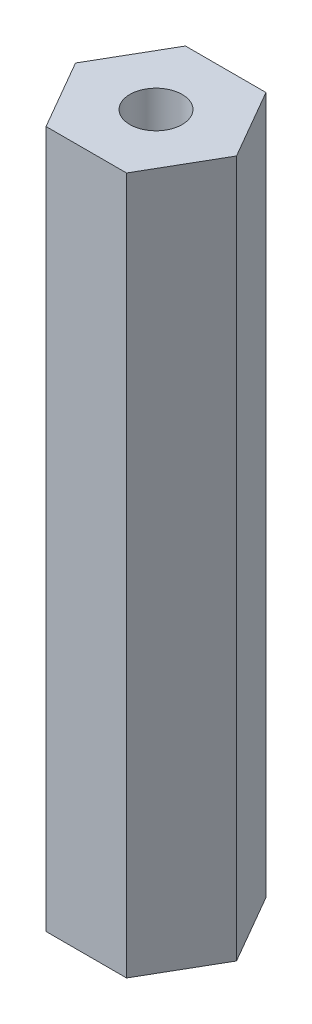
ISO-10303-21;
HEADER;
FILE_DESCRIPTION(('STEP AP214'),'2;1');
FILE_NAME('part.step','',(''),(''),'','','');
FILE_SCHEMA(('AUTOMOTIVE_DESIGN { 1 0 10303 214 1 1 1 1 }'));
ENDSEC;
DATA;
#1=APPLICATION_CONTEXT('core data for automotive mechanical design processes');
#2=APPLICATION_PROTOCOL_DEFINITION('international standard','automotive_design',2000,#1);
#3=PRODUCT_CONTEXT('',#1,'mechanical');
#4=PRODUCT('Part','Part','',(#3));
#5=PRODUCT_RELATED_PRODUCT_CATEGORY('part','',(#4));
#6=PRODUCT_DEFINITION_FORMATION('','',#4);
#7=PRODUCT_DEFINITION_CONTEXT('part definition',#1,'design');
#8=PRODUCT_DEFINITION('design','',#6,#7);
#9=PRODUCT_DEFINITION_SHAPE('','',#8);
#10=(LENGTH_UNIT() NAMED_UNIT(*) SI_UNIT(.MILLI.,.METRE.));
#11=(NAMED_UNIT(*) PLANE_ANGLE_UNIT() SI_UNIT($,.RADIAN.));
#12=(NAMED_UNIT(*) SI_UNIT($,.STERADIAN.) SOLID_ANGLE_UNIT());
#13=UNCERTAINTY_MEASURE_WITH_UNIT(LENGTH_MEASURE(1.E-05),#10,'distance_accuracy_value','');
#14=(GEOMETRIC_REPRESENTATION_CONTEXT(3) GLOBAL_UNCERTAINTY_ASSIGNED_CONTEXT((#13)) GLOBAL_UNIT_ASSIGNED_CONTEXT((#10,
#11,#12)) REPRESENTATION_CONTEXT('',''));
#15=CARTESIAN_POINT('',(0.,0.,0.));
#16=DIRECTION('',(0.,0.,1.));
#17=DIRECTION('',(1.,0.,0.));
#18=AXIS2_PLACEMENT_3D('',#15,#16,#17);
#19=CARTESIAN_POINT('',(3.46410161513775,60.,6.));
#20=DIRECTION('',(-0.866025403784439,0.,-0.5));
#21=DIRECTION('',(-0.5,0.,0.866025403784439));
#22=AXIS2_PLACEMENT_3D('',#19,#20,#21);
#23=PLANE('',#22);
#24=DIRECTION('',(0.5,0.,-0.866025403784439));
#25=VECTOR('',#24,1.);
#26=CARTESIAN_POINT('',(3.46410161513775,0.,6.));
#27=LINE('',#26,#25);
#28=CARTESIAN_POINT('',(3.46410161513775,0.,6.));
#29=VERTEX_POINT('',#28);
#30=CARTESIAN_POINT('',(6.92820323027551,0.,0.));
#31=VERTEX_POINT('',#30);
#32=EDGE_CURVE('E121',#29,#31,#27,.T.);
#33=ORIENTED_EDGE('',*,*,#32,.T.);
#34=DIRECTION('',(0.,-1.,0.));
#35=VECTOR('',#34,1.);
#36=CARTESIAN_POINT('',(6.92820323027551,60.,0.));
#37=LINE('',#36,#35);
#38=CARTESIAN_POINT('',(6.92820323027551,60.,0.));
#39=VERTEX_POINT('',#38);
#40=EDGE_CURVE('E11',#39,#31,#37,.T.);
#41=ORIENTED_EDGE('',*,*,#40,.F.);
#42=DIRECTION('',(0.5,0.,-0.866025403784439));
#43=VECTOR('',#42,1.);
#44=CARTESIAN_POINT('',(3.46410161513775,60.,6.));
#45=LINE('',#44,#43);
#46=CARTESIAN_POINT('',(3.46410161513775,60.,6.));
#47=VERTEX_POINT('',#46);
#48=EDGE_CURVE('E132',#47,#39,#45,.T.);
#49=ORIENTED_EDGE('',*,*,#48,.F.);
#50=DIRECTION('',(0.,-1.,0.));
#51=VECTOR('',#50,1.);
#52=CARTESIAN_POINT('',(3.46410161513775,60.,6.));
#53=LINE('',#52,#51);
#54=EDGE_CURVE('E117',#47,#29,#53,.T.);
#55=ORIENTED_EDGE('',*,*,#54,.T.);
#56=EDGE_LOOP('',(#33,#41,#49,#55));
#57=FACE_BOUND('',#56,.T.);
#58=ADVANCED_FACE('F37',(#57),#23,.F.);
#59=CARTESIAN_POINT('',(6.92820323027551,60.,0.));
#60=DIRECTION('',(-0.866025403784438,0.,0.5));
#61=DIRECTION('',(0.5,0.,0.866025403784439));
#62=AXIS2_PLACEMENT_3D('',#59,#60,#61);
#63=PLANE('',#62);
#64=DIRECTION('',(-0.5,0.,-0.866025403784438));
#65=VECTOR('',#64,1.);
#66=CARTESIAN_POINT('',(6.92820323027551,0.,0.));
#67=LINE('',#66,#65);
#68=CARTESIAN_POINT('',(3.46410161513775,0.,-6.));
#69=VERTEX_POINT('',#68);
#70=EDGE_CURVE('E124',#31,#69,#67,.T.);
#71=ORIENTED_EDGE('',*,*,#70,.T.);
#72=DIRECTION('',(0.,-1.,0.));
#73=VECTOR('',#72,1.);
#74=CARTESIAN_POINT('',(3.46410161513775,60.,-6.));
#75=LINE('',#74,#73);
#76=CARTESIAN_POINT('',(3.46410161513775,60.,-6.));
#77=VERTEX_POINT('',#76);
#78=EDGE_CURVE('E45',#77,#69,#75,.T.);
#79=ORIENTED_EDGE('',*,*,#78,.F.);
#80=DIRECTION('',(-0.5,0.,-0.866025403784438));
#81=VECTOR('',#80,1.);
#82=CARTESIAN_POINT('',(6.92820323027551,60.,0.));
#83=LINE('',#82,#81);
#84=EDGE_CURVE('E90',#39,#77,#83,.T.);
#85=ORIENTED_EDGE('',*,*,#84,.F.);
#86=ORIENTED_EDGE('',*,*,#40,.T.);
#87=EDGE_LOOP('',(#71,#79,#85,#86));
#88=FACE_BOUND('',#87,.T.);
#89=ADVANCED_FACE('F157',(#88),#63,.F.);
#90=CARTESIAN_POINT('',(3.46410161513775,60.,-6.));
#91=DIRECTION('',(0.,0.,1.));
#92=DIRECTION('',(1.,0.,0.));
#93=AXIS2_PLACEMENT_3D('',#90,#91,#92);
#94=PLANE('',#93);
#95=DIRECTION('',(-1.,0.,0.));
#96=VECTOR('',#95,1.);
#97=CARTESIAN_POINT('',(3.46410161513775,0.,-6.));
#98=LINE('',#97,#96);
#99=CARTESIAN_POINT('',(-3.46410161513776,0.,-6.));
#100=VERTEX_POINT('',#99);
#101=EDGE_CURVE('E127',#69,#100,#98,.T.);
#102=ORIENTED_EDGE('',*,*,#101,.T.);
#103=DIRECTION('',(0.,-1.,0.));
#104=VECTOR('',#103,1.);
#105=CARTESIAN_POINT('',(-3.46410161513776,60.,-6.));
#106=LINE('',#105,#104);
#107=CARTESIAN_POINT('',(-3.46410161513776,60.,-6.));
#108=VERTEX_POINT('',#107);
#109=EDGE_CURVE('E112',#108,#100,#106,.T.);
#110=ORIENTED_EDGE('',*,*,#109,.F.);
#111=DIRECTION('',(-1.,0.,0.));
#112=VECTOR('',#111,1.);
#113=CARTESIAN_POINT('',(3.46410161513775,60.,-6.));
#114=LINE('',#113,#112);
#115=EDGE_CURVE('E103',#77,#108,#114,.T.);
#116=ORIENTED_EDGE('',*,*,#115,.F.);
#117=ORIENTED_EDGE('',*,*,#78,.T.);
#118=EDGE_LOOP('',(#102,#110,#116,#117));
#119=FACE_BOUND('',#118,.T.);
#120=ADVANCED_FACE('F138',(#119),#94,.F.);
#121=CARTESIAN_POINT('',(-3.46410161513776,60.,-6.));
#122=DIRECTION('',(0.866025403784439,0.,0.5));
#123=DIRECTION('',(0.5,0.,-0.866025403784439));
#124=AXIS2_PLACEMENT_3D('',#121,#122,#123);
#125=PLANE('',#124);
#126=DIRECTION('',(-0.5,0.,0.866025403784439));
#127=VECTOR('',#126,1.);
#128=CARTESIAN_POINT('',(-3.46410161513776,0.,-6.));
#129=LINE('',#128,#127);
#130=CARTESIAN_POINT('',(-6.92820323027551,0.,0.));
#131=VERTEX_POINT('',#130);
#132=EDGE_CURVE('E111',#100,#131,#129,.T.);
#133=ORIENTED_EDGE('',*,*,#132,.T.);
#134=DIRECTION('',(0.,-1.,0.));
#135=VECTOR('',#134,1.);
#136=CARTESIAN_POINT('',(-6.92820323027551,60.,0.));
#137=LINE('',#136,#135);
#138=CARTESIAN_POINT('',(-6.92820323027551,60.,0.));
#139=VERTEX_POINT('',#138);
#140=EDGE_CURVE('E108',#139,#131,#137,.T.);
#141=ORIENTED_EDGE('',*,*,#140,.F.);
#142=DIRECTION('',(-0.5,0.,0.866025403784439));
#143=VECTOR('',#142,1.);
#144=CARTESIAN_POINT('',(-3.46410161513776,60.,-6.));
#145=LINE('',#144,#143);
#146=EDGE_CURVE('E97',#108,#139,#145,.T.);
#147=ORIENTED_EDGE('',*,*,#146,.F.);
#148=ORIENTED_EDGE('',*,*,#109,.T.);
#149=EDGE_LOOP('',(#133,#141,#147,#148));
#150=FACE_BOUND('',#149,.T.);
#151=ADVANCED_FACE('F109',(#150),#125,.F.);
#152=CARTESIAN_POINT('',(-6.92820323027551,60.,0.));
#153=DIRECTION('',(0.866025403784438,0.,-0.5));
#154=DIRECTION('',(-0.5,0.,-0.866025403784439));
#155=AXIS2_PLACEMENT_3D('',#152,#153,#154);
#156=PLANE('',#155);
#157=DIRECTION('',(0.5,0.,0.866025403784438));
#158=VECTOR('',#157,1.);
#159=CARTESIAN_POINT('',(-6.92820323027551,0.,0.));
#160=LINE('',#159,#158);
#161=CARTESIAN_POINT('',(-3.46410161513775,0.,6.));
#162=VERTEX_POINT('',#161);
#163=EDGE_CURVE('E76',#131,#162,#160,.T.);
#164=ORIENTED_EDGE('',*,*,#163,.T.);
#165=DIRECTION('',(0.,-1.,0.));
#166=VECTOR('',#165,1.);
#167=CARTESIAN_POINT('',(-3.46410161513775,60.,6.));
#168=LINE('',#167,#166);
#169=CARTESIAN_POINT('',(-3.46410161513775,60.,6.));
#170=VERTEX_POINT('',#169);
#171=EDGE_CURVE('E113',#170,#162,#168,.T.);
#172=ORIENTED_EDGE('',*,*,#171,.F.);
#173=DIRECTION('',(0.5,0.,0.866025403784438));
#174=VECTOR('',#173,1.);
#175=CARTESIAN_POINT('',(-6.92820323027551,60.,0.));
#176=LINE('',#175,#174);
#177=EDGE_CURVE('E101',#139,#170,#176,.T.);
#178=ORIENTED_EDGE('',*,*,#177,.F.);
#179=ORIENTED_EDGE('',*,*,#140,.T.);
#180=EDGE_LOOP('',(#164,#172,#178,#179));
#181=FACE_BOUND('',#180,.T.);
#182=ADVANCED_FACE('F115',(#181),#156,.F.);
#183=CARTESIAN_POINT('',(-3.46410161513775,60.,6.));
#184=DIRECTION('',(0.,0.,-1.));
#185=DIRECTION('',(-1.,0.,0.));
#186=AXIS2_PLACEMENT_3D('',#183,#184,#185);
#187=PLANE('',#186);
#188=DIRECTION('',(1.,0.,0.));
#189=VECTOR('',#188,1.);
#190=CARTESIAN_POINT('',(-3.46410161513775,0.,6.));
#191=LINE('',#190,#189);
#192=EDGE_CURVE('E82',#162,#29,#191,.T.);
#193=ORIENTED_EDGE('',*,*,#192,.T.);
#194=ORIENTED_EDGE('',*,*,#54,.F.);
#195=DIRECTION('',(1.,0.,0.));
#196=VECTOR('',#195,1.);
#197=CARTESIAN_POINT('',(-3.46410161513775,60.,6.));
#198=LINE('',#197,#196);
#199=EDGE_CURVE('E53',#170,#47,#198,.T.);
#200=ORIENTED_EDGE('',*,*,#199,.F.);
#201=ORIENTED_EDGE('',*,*,#171,.T.);
#202=EDGE_LOOP('',(#193,#194,#200,#201));
#203=FACE_BOUND('',#202,.T.);
#204=ADVANCED_FACE('F145',(#203),#187,.F.);
#205=CARTESIAN_POINT('',(0.,60.,0.));
#206=DIRECTION('',(0.,1.,0.));
#207=DIRECTION('',(0.,0.,1.));
#208=AXIS2_PLACEMENT_3D('',#205,#206,#207);
#209=PLANE('',#208);
#210=CARTESIAN_POINT('',(0.,60.,0.));
#211=DIRECTION('',(0.,1.,0.));
#212=DIRECTION('',(0.,0.,1.));
#213=AXIS2_PLACEMENT_3D('',#210,#211,#212);
#214=CIRCLE('',#213,2.25);
#215=CARTESIAN_POINT('',(0.,60.,2.25));
#216=VERTEX_POINT('',#215);
#217=EDGE_CURVE('E125',#216,#216,#214,.T.);
#218=ORIENTED_EDGE('',*,*,#217,.F.);
#219=EDGE_LOOP('',(#218));
#220=FACE_BOUND('',#219,.T.);
#221=ORIENTED_EDGE('',*,*,#48,.T.);
#222=ORIENTED_EDGE('',*,*,#84,.T.);
#223=ORIENTED_EDGE('',*,*,#115,.T.);
#224=ORIENTED_EDGE('',*,*,#146,.T.);
#225=ORIENTED_EDGE('',*,*,#177,.T.);
#226=ORIENTED_EDGE('',*,*,#199,.T.);
#227=EDGE_LOOP('',(#221,#222,#223,#224,#225,#226));
#228=FACE_BOUND('',#227,.T.);
#229=ADVANCED_FACE('F99',(#220,#228),#209,.T.);
#230=CARTESIAN_POINT('',(0.,0.,0.));
#231=DIRECTION('',(0.,1.,0.));
#232=DIRECTION('',(0.,0.,1.));
#233=AXIS2_PLACEMENT_3D('',#230,#231,#232);
#234=PLANE('',#233);
#235=CARTESIAN_POINT('',(0.,0.,0.));
#236=DIRECTION('',(0.,1.,0.));
#237=DIRECTION('',(0.,0.,1.));
#238=AXIS2_PLACEMENT_3D('',#235,#236,#237);
#239=CIRCLE('',#238,2.25);
#240=CARTESIAN_POINT('',(0.,0.,2.25));
#241=VERTEX_POINT('',#240);
#242=EDGE_CURVE('E244',#241,#241,#239,.T.);
#243=ORIENTED_EDGE('',*,*,#242,.T.);
#244=EDGE_LOOP('',(#243));
#245=FACE_BOUND('',#244,.T.);
#246=ORIENTED_EDGE('',*,*,#32,.F.);
#247=ORIENTED_EDGE('',*,*,#192,.F.);
#248=ORIENTED_EDGE('',*,*,#163,.F.);
#249=ORIENTED_EDGE('',*,*,#132,.F.);
#250=ORIENTED_EDGE('',*,*,#101,.F.);
#251=ORIENTED_EDGE('',*,*,#70,.F.);
#252=EDGE_LOOP('',(#246,#247,#248,#249,#250,#251));
#253=FACE_BOUND('',#252,.T.);
#254=ADVANCED_FACE('F141',(#245,#253),#234,.F.);
#255=CARTESIAN_POINT('',(0.,60.,0.));
#256=DIRECTION('',(0.,-1.,0.));
#257=DIRECTION('',(0.,0.,-1.));
#258=AXIS2_PLACEMENT_3D('',#255,#256,#257);
#259=CYLINDRICAL_SURFACE('',#258,2.25);
#260=ORIENTED_EDGE('',*,*,#217,.T.);
#261=EDGE_LOOP('',(#260));
#262=FACE_BOUND('',#261,.T.);
#263=ORIENTED_EDGE('',*,*,#242,.F.);
#264=EDGE_LOOP('',(#263));
#265=FACE_BOUND('',#264,.T.);
#266=ADVANCED_FACE('F197',(#262,#265),#259,.F.);
#267=CLOSED_SHELL('',(#58,#89,#120,#151,#182,#204,#229,#254,#266));
#268=MANIFOLD_SOLID_BREP('B2',#267);
#269=ADVANCED_BREP_SHAPE_REPRESENTATION('',(#18,#268),#14);
#270=SHAPE_DEFINITION_REPRESENTATION(#9,#269);
ENDSEC;
END-ISO-10303-21;
